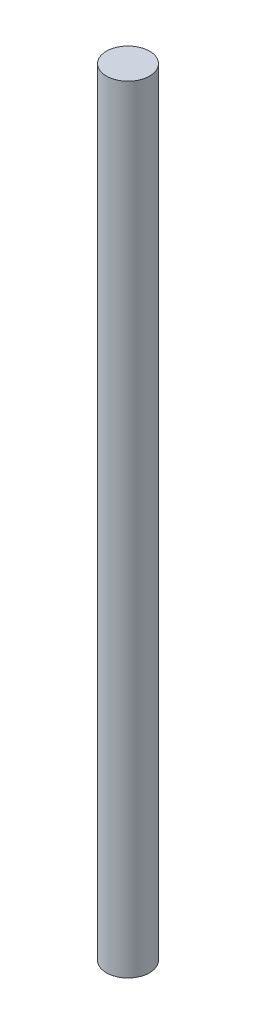
ISO-10303-21;
HEADER;
FILE_DESCRIPTION(('STEP AP214'),'2;1');
FILE_NAME('part.step','',(''),(''),'','','');
FILE_SCHEMA(('AUTOMOTIVE_DESIGN { 1 0 10303 214 1 1 1 1 }'));
ENDSEC;
DATA;
#1=APPLICATION_CONTEXT('core data for automotive mechanical design processes');
#2=APPLICATION_PROTOCOL_DEFINITION('international standard','automotive_design',2000,#1);
#3=PRODUCT_CONTEXT('',#1,'mechanical');
#4=PRODUCT('Part','Part','',(#3));
#5=PRODUCT_RELATED_PRODUCT_CATEGORY('part','',(#4));
#6=PRODUCT_DEFINITION_FORMATION('','',#4);
#7=PRODUCT_DEFINITION_CONTEXT('part definition',#1,'design');
#8=PRODUCT_DEFINITION('design','',#6,#7);
#9=PRODUCT_DEFINITION_SHAPE('','',#8);
#10=(LENGTH_UNIT() NAMED_UNIT(*) SI_UNIT(.MILLI.,.METRE.));
#11=(NAMED_UNIT(*) PLANE_ANGLE_UNIT() SI_UNIT($,.RADIAN.));
#12=(NAMED_UNIT(*) SI_UNIT($,.STERADIAN.) SOLID_ANGLE_UNIT());
#13=UNCERTAINTY_MEASURE_WITH_UNIT(LENGTH_MEASURE(1.E-05),#10,'distance_accuracy_value','');
#14=(GEOMETRIC_REPRESENTATION_CONTEXT(3) GLOBAL_UNCERTAINTY_ASSIGNED_CONTEXT((#13)) GLOBAL_UNIT_ASSIGNED_CONTEXT((#10,
#11,#12)) REPRESENTATION_CONTEXT('',''));
#15=CARTESIAN_POINT('',(0.,0.,0.));
#16=DIRECTION('',(0.,0.,1.));
#17=DIRECTION('',(1.,0.,0.));
#18=AXIS2_PLACEMENT_3D('',#15,#16,#17);
#19=CARTESIAN_POINT('',(0.,540.,0.));
#20=DIRECTION('',(0.,-1.,0.));
#21=DIRECTION('',(0.,0.,-1.));
#22=AXIS2_PLACEMENT_3D('',#19,#20,#21);
#23=CYLINDRICAL_SURFACE('',#22,15.);
#24=CARTESIAN_POINT('',(0.,540.,0.));
#25=DIRECTION('',(0.,1.,0.));
#26=DIRECTION('',(0.,0.,1.));
#27=AXIS2_PLACEMENT_3D('',#24,#25,#26);
#28=CIRCLE('',#27,15.);
#29=CARTESIAN_POINT('',(0.,540.,15.));
#30=VERTEX_POINT('',#29);
#31=EDGE_CURVE('E10',#30,#30,#28,.T.);
#32=ORIENTED_EDGE('',*,*,#31,.F.);
#33=EDGE_LOOP('',(#32));
#34=FACE_BOUND('',#33,.T.);
#35=CARTESIAN_POINT('',(0.,0.,0.));
#36=DIRECTION('',(0.,1.,0.));
#37=DIRECTION('',(0.,0.,1.));
#38=AXIS2_PLACEMENT_3D('',#35,#36,#37);
#39=CIRCLE('',#38,15.);
#40=CARTESIAN_POINT('',(0.,0.,15.));
#41=VERTEX_POINT('',#40);
#42=EDGE_CURVE('E36',#41,#41,#39,.T.);
#43=ORIENTED_EDGE('',*,*,#42,.T.);
#44=EDGE_LOOP('',(#43));
#45=FACE_BOUND('',#44,.T.);
#46=ADVANCED_FACE('F33',(#34,#45),#23,.T.);
#47=CARTESIAN_POINT('',(0.,540.,0.));
#48=DIRECTION('',(0.,1.,0.));
#49=DIRECTION('',(0.,0.,1.));
#50=AXIS2_PLACEMENT_3D('',#47,#48,#49);
#51=PLANE('',#50);
#52=ORIENTED_EDGE('',*,*,#31,.T.);
#53=EDGE_LOOP('',(#52));
#54=FACE_BOUND('',#53,.T.);
#55=ADVANCED_FACE('F48',(#54),#51,.T.);
#56=CARTESIAN_POINT('',(0.,0.,0.));
#57=DIRECTION('',(0.,1.,0.));
#58=DIRECTION('',(0.,0.,1.));
#59=AXIS2_PLACEMENT_3D('',#56,#57,#58);
#60=PLANE('',#59);
#61=ORIENTED_EDGE('',*,*,#42,.F.);
#62=EDGE_LOOP('',(#61));
#63=FACE_BOUND('',#62,.T.);
#64=ADVANCED_FACE('F46',(#63),#60,.F.);
#65=CLOSED_SHELL('',(#46,#55,#64));
#66=MANIFOLD_SOLID_BREP('B2',#65);
#67=ADVANCED_BREP_SHAPE_REPRESENTATION('',(#18,#66),#14);
#68=SHAPE_DEFINITION_REPRESENTATION(#9,#67);
ENDSEC;
END-ISO-10303-21;
